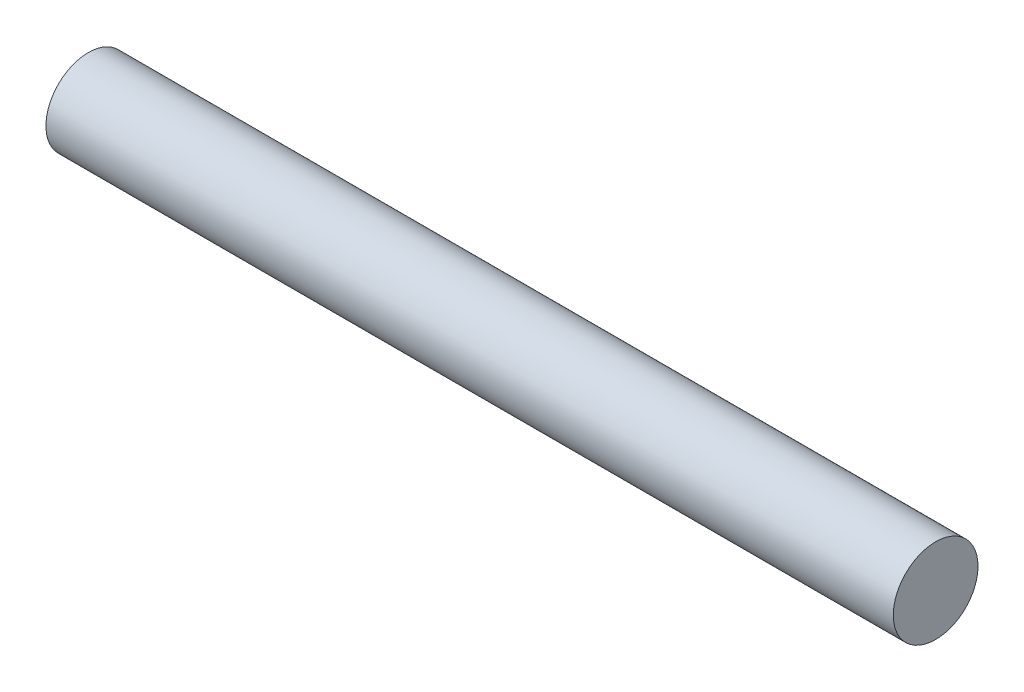
ISO-10303-21;
HEADER;
FILE_DESCRIPTION(('STEP AP214'),'2;1');
FILE_NAME('part.step','',(''),(''),'','','');
FILE_SCHEMA(('AUTOMOTIVE_DESIGN { 1 0 10303 214 1 1 1 1 }'));
ENDSEC;
DATA;
#1=APPLICATION_CONTEXT('core data for automotive mechanical design processes');
#2=APPLICATION_PROTOCOL_DEFINITION('international standard','automotive_design',2000,#1);
#3=PRODUCT_CONTEXT('',#1,'mechanical');
#4=PRODUCT('Part','Part','',(#3));
#5=PRODUCT_RELATED_PRODUCT_CATEGORY('part','',(#4));
#6=PRODUCT_DEFINITION_FORMATION('','',#4);
#7=PRODUCT_DEFINITION_CONTEXT('part definition',#1,'design');
#8=PRODUCT_DEFINITION('design','',#6,#7);
#9=PRODUCT_DEFINITION_SHAPE('','',#8);
#10=(LENGTH_UNIT() NAMED_UNIT(*) SI_UNIT(.MILLI.,.METRE.));
#11=(NAMED_UNIT(*) PLANE_ANGLE_UNIT() SI_UNIT($,.RADIAN.));
#12=(NAMED_UNIT(*) SI_UNIT($,.STERADIAN.) SOLID_ANGLE_UNIT());
#13=UNCERTAINTY_MEASURE_WITH_UNIT(LENGTH_MEASURE(1.E-05),#10,'distance_accuracy_value','');
#14=(GEOMETRIC_REPRESENTATION_CONTEXT(3) GLOBAL_UNCERTAINTY_ASSIGNED_CONTEXT((#13)) GLOBAL_UNIT_ASSIGNED_CONTEXT((#10,
#11,#12)) REPRESENTATION_CONTEXT('',''));
#15=CARTESIAN_POINT('',(0.,0.,0.));
#16=DIRECTION('',(0.,0.,1.));
#17=DIRECTION('',(1.,0.,0.));
#18=AXIS2_PLACEMENT_3D('',#15,#16,#17);
#19=CARTESIAN_POINT('',(1000.,0.,0.));
#20=DIRECTION('',(-1.,0.,0.));
#21=DIRECTION('',(0.,0.,1.));
#22=AXIS2_PLACEMENT_3D('',#19,#20,#21);
#23=CYLINDRICAL_SURFACE('',#22,50.);
#24=CARTESIAN_POINT('',(1000.,0.,0.));
#25=DIRECTION('',(1.,0.,0.));
#26=DIRECTION('',(0.,0.,-1.));
#27=AXIS2_PLACEMENT_3D('',#24,#25,#26);
#28=CIRCLE('',#27,50.);
#29=CARTESIAN_POINT('',(1000.,0.,-50.));
#30=VERTEX_POINT('',#29);
#31=EDGE_CURVE('E10',#30,#30,#28,.T.);
#32=ORIENTED_EDGE('',*,*,#31,.F.);
#33=EDGE_LOOP('',(#32));
#34=FACE_BOUND('',#33,.T.);
#35=CARTESIAN_POINT('',(0.,0.,0.));
#36=DIRECTION('',(1.,0.,0.));
#37=DIRECTION('',(0.,0.,-1.));
#38=AXIS2_PLACEMENT_3D('',#35,#36,#37);
#39=CIRCLE('',#38,50.);
#40=CARTESIAN_POINT('',(0.,0.,-50.));
#41=VERTEX_POINT('',#40);
#42=EDGE_CURVE('E42',#41,#41,#39,.T.);
#43=ORIENTED_EDGE('',*,*,#42,.T.);
#44=EDGE_LOOP('',(#43));
#45=FACE_BOUND('',#44,.T.);
#46=ADVANCED_FACE('F39',(#34,#45),#23,.T.);
#47=CARTESIAN_POINT('',(1000.,0.,0.));
#48=DIRECTION('',(1.,0.,0.));
#49=DIRECTION('',(0.,0.,-1.));
#50=AXIS2_PLACEMENT_3D('',#47,#48,#49);
#51=PLANE('',#50);
#52=ORIENTED_EDGE('',*,*,#31,.T.);
#53=EDGE_LOOP('',(#52));
#54=FACE_BOUND('',#53,.T.);
#55=ADVANCED_FACE('F54',(#54),#51,.T.);
#56=CARTESIAN_POINT('',(0.,0.,0.));
#57=DIRECTION('',(1.,0.,0.));
#58=DIRECTION('',(0.,0.,-1.));
#59=AXIS2_PLACEMENT_3D('',#56,#57,#58);
#60=PLANE('',#59);
#61=ORIENTED_EDGE('',*,*,#42,.F.);
#62=EDGE_LOOP('',(#61));
#63=FACE_BOUND('',#62,.T.);
#64=ADVANCED_FACE('F52',(#63),#60,.F.);
#65=CLOSED_SHELL('',(#46,#55,#64));
#66=MANIFOLD_SOLID_BREP('B2',#65);
#67=ADVANCED_BREP_SHAPE_REPRESENTATION('',(#18,#66),#14);
#68=SHAPE_DEFINITION_REPRESENTATION(#9,#67);
ENDSEC;
END-ISO-10303-21;
